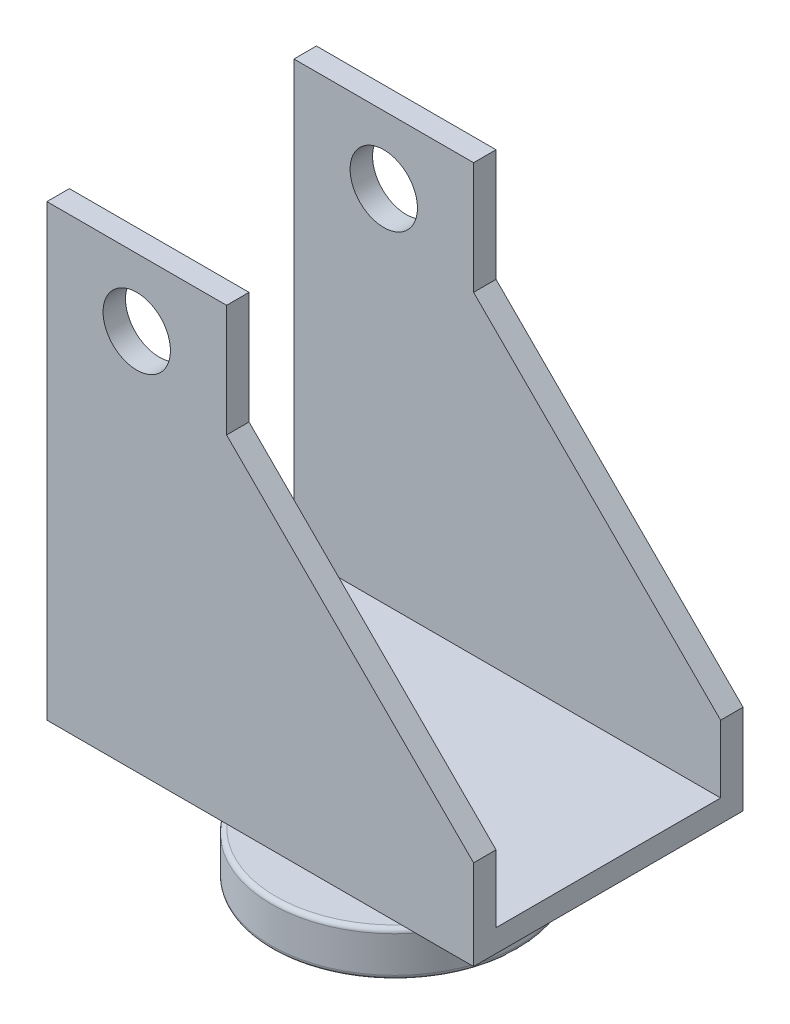
ISO-10303-21;
HEADER;
FILE_DESCRIPTION(('STEP AP214'),'2;1');
FILE_NAME('part.step','',(''),(''),'','','');
FILE_SCHEMA(('AUTOMOTIVE_DESIGN { 1 0 10303 214 1 1 1 1 }'));
ENDSEC;
DATA;
#1=APPLICATION_CONTEXT('core data for automotive mechanical design processes');
#2=APPLICATION_PROTOCOL_DEFINITION('international standard','automotive_design',2000,#1);
#3=PRODUCT_CONTEXT('',#1,'mechanical');
#4=PRODUCT('Part','Part','',(#3));
#5=PRODUCT_RELATED_PRODUCT_CATEGORY('part','',(#4));
#6=PRODUCT_DEFINITION_FORMATION('','',#4);
#7=PRODUCT_DEFINITION_CONTEXT('part definition',#1,'design');
#8=PRODUCT_DEFINITION('design','',#6,#7);
#9=PRODUCT_DEFINITION_SHAPE('','',#8);
#10=(LENGTH_UNIT() NAMED_UNIT(*) SI_UNIT(.MILLI.,.METRE.));
#11=(NAMED_UNIT(*) PLANE_ANGLE_UNIT() SI_UNIT($,.RADIAN.));
#12=(NAMED_UNIT(*) SI_UNIT($,.STERADIAN.) SOLID_ANGLE_UNIT());
#13=UNCERTAINTY_MEASURE_WITH_UNIT(LENGTH_MEASURE(1.E-05),#10,'distance_accuracy_value','');
#14=(GEOMETRIC_REPRESENTATION_CONTEXT(3) GLOBAL_UNCERTAINTY_ASSIGNED_CONTEXT((#13)) GLOBAL_UNIT_ASSIGNED_CONTEXT((#10,
#11,#12)) REPRESENTATION_CONTEXT('',''));
#15=CARTESIAN_POINT('',(0.,0.,0.));
#16=DIRECTION('',(0.,0.,1.));
#17=DIRECTION('',(1.,0.,0.));
#18=AXIS2_PLACEMENT_3D('',#15,#16,#17);
#19=CARTESIAN_POINT('',(95.,5.,-25.));
#20=DIRECTION('',(1.,0.,0.));
#21=DIRECTION('',(0.,0.,-1.));
#22=AXIS2_PLACEMENT_3D('',#19,#20,#21);
#23=PLANE('',#22);
#24=DIRECTION('',(0.,0.,1.));
#25=VECTOR('',#24,1.);
#26=CARTESIAN_POINT('',(95.,0.,-25.));
#27=LINE('',#26,#25);
#28=CARTESIAN_POINT('',(95.,0.,-30.));
#29=VERTEX_POINT('',#28);
#30=CARTESIAN_POINT('',(95.,0.,30.));
#31=VERTEX_POINT('',#30);
#32=EDGE_CURVE('E152',#29,#31,#27,.T.);
#33=ORIENTED_EDGE('',*,*,#32,.F.);
#34=DIRECTION('',(0.,-1.,0.));
#35=VECTOR('',#34,1.);
#36=CARTESIAN_POINT('',(95.,20.,-30.));
#37=LINE('',#36,#35);
#38=CARTESIAN_POINT('',(95.,20.,-30.));
#39=VERTEX_POINT('',#38);
#40=EDGE_CURVE('E135',#39,#29,#37,.T.);
#41=ORIENTED_EDGE('',*,*,#40,.F.);
#42=DIRECTION('',(0.,0.,1.));
#43=VECTOR('',#42,1.);
#44=CARTESIAN_POINT('',(95.,20.,-30.));
#45=LINE('',#44,#43);
#46=CARTESIAN_POINT('',(95.,20.,-25.));
#47=VERTEX_POINT('',#46);
#48=EDGE_CURVE('E143',#39,#47,#45,.T.);
#49=ORIENTED_EDGE('',*,*,#48,.T.);
#50=DIRECTION('',(0.,-1.,0.));
#51=VECTOR('',#50,1.);
#52=CARTESIAN_POINT('',(95.,20.,-25.));
#53=LINE('',#52,#51);
#54=CARTESIAN_POINT('',(95.,5.,-25.));
#55=VERTEX_POINT('',#54);
#56=EDGE_CURVE('E168',#47,#55,#53,.T.);
#57=ORIENTED_EDGE('',*,*,#56,.T.);
#58=DIRECTION('',(0.,0.,1.));
#59=VECTOR('',#58,1.);
#60=CARTESIAN_POINT('',(95.,5.,-25.));
#61=LINE('',#60,#59);
#62=CARTESIAN_POINT('',(95.,5.,25.));
#63=VERTEX_POINT('',#62);
#64=EDGE_CURVE('E55',#55,#63,#61,.T.);
#65=ORIENTED_EDGE('',*,*,#64,.T.);
#66=DIRECTION('',(0.,-1.,0.));
#67=VECTOR('',#66,1.);
#68=CARTESIAN_POINT('',(95.,20.,25.));
#69=LINE('',#68,#67);
#70=CARTESIAN_POINT('',(95.,20.,25.));
#71=VERTEX_POINT('',#70);
#72=EDGE_CURVE('E205',#71,#63,#69,.T.);
#73=ORIENTED_EDGE('',*,*,#72,.F.);
#74=DIRECTION('',(0.,0.,-1.));
#75=VECTOR('',#74,1.);
#76=CARTESIAN_POINT('',(95.,20.,30.));
#77=LINE('',#76,#75);
#78=CARTESIAN_POINT('',(95.,20.,30.));
#79=VERTEX_POINT('',#78);
#80=EDGE_CURVE('E218',#79,#71,#77,.T.);
#81=ORIENTED_EDGE('',*,*,#80,.F.);
#82=DIRECTION('',(0.,-1.,0.));
#83=VECTOR('',#82,1.);
#84=CARTESIAN_POINT('',(95.,20.,30.));
#85=LINE('',#84,#83);
#86=EDGE_CURVE('E186',#79,#31,#85,.T.);
#87=ORIENTED_EDGE('',*,*,#86,.T.);
#88=EDGE_LOOP('',(#33,#41,#49,#57,#65,#73,#81,#87));
#89=FACE_BOUND('',#88,.T.);
#90=ADVANCED_FACE('F40',(#89),#23,.T.);
#91=CARTESIAN_POINT('',(0.,5.,0.));
#92=DIRECTION('',(-1.,0.,0.));
#93=DIRECTION('',(0.,0.,1.));
#94=AXIS2_PLACEMENT_3D('',#91,#92,#93);
#95=PLANE('',#94);
#96=DIRECTION('',(0.,0.,-1.));
#97=VECTOR('',#96,1.);
#98=CARTESIAN_POINT('',(0.,0.,0.));
#99=LINE('',#98,#97);
#100=CARTESIAN_POINT('',(0.,0.,30.));
#101=VERTEX_POINT('',#100);
#102=CARTESIAN_POINT('',(0.,0.,-30.));
#103=VERTEX_POINT('',#102);
#104=EDGE_CURVE('E220',#101,#103,#99,.T.);
#105=ORIENTED_EDGE('',*,*,#104,.F.);
#106=DIRECTION('',(0.,1.,0.));
#107=VECTOR('',#106,1.);
#108=CARTESIAN_POINT('',(0.,0.,30.));
#109=LINE('',#108,#107);
#110=CARTESIAN_POINT('',(0.,100.,30.));
#111=VERTEX_POINT('',#110);
#112=EDGE_CURVE('E192',#101,#111,#109,.T.);
#113=ORIENTED_EDGE('',*,*,#112,.T.);
#114=DIRECTION('',(0.,0.,-1.));
#115=VECTOR('',#114,1.);
#116=CARTESIAN_POINT('',(0.,100.,30.));
#117=LINE('',#116,#115);
#118=CARTESIAN_POINT('',(0.,100.,25.));
#119=VERTEX_POINT('',#118);
#120=EDGE_CURVE('E204',#111,#119,#117,.T.);
#121=ORIENTED_EDGE('',*,*,#120,.T.);
#122=DIRECTION('',(0.,1.,0.));
#123=VECTOR('',#122,1.);
#124=CARTESIAN_POINT('',(0.,0.,25.));
#125=LINE('',#124,#123);
#126=CARTESIAN_POINT('',(0.,5.,25.));
#127=VERTEX_POINT('',#126);
#128=EDGE_CURVE('E208',#127,#119,#125,.T.);
#129=ORIENTED_EDGE('',*,*,#128,.F.);
#130=DIRECTION('',(0.,0.,-1.));
#131=VECTOR('',#130,1.);
#132=CARTESIAN_POINT('',(0.,5.,25.));
#133=LINE('',#132,#131);
#134=CARTESIAN_POINT('',(0.,5.,-25.));
#135=VERTEX_POINT('',#134);
#136=EDGE_CURVE('E63',#127,#135,#133,.T.);
#137=ORIENTED_EDGE('',*,*,#136,.T.);
#138=DIRECTION('',(0.,1.,0.));
#139=VECTOR('',#138,1.);
#140=CARTESIAN_POINT('',(0.,0.,-25.));
#141=LINE('',#140,#139);
#142=CARTESIAN_POINT('',(0.,100.,-25.));
#143=VERTEX_POINT('',#142);
#144=EDGE_CURVE('E154',#135,#143,#141,.T.);
#145=ORIENTED_EDGE('',*,*,#144,.T.);
#146=DIRECTION('',(0.,0.,1.));
#147=VECTOR('',#146,1.);
#148=CARTESIAN_POINT('',(0.,100.,-30.));
#149=LINE('',#148,#147);
#150=CARTESIAN_POINT('',(0.,100.,-30.));
#151=VERTEX_POINT('',#150);
#152=EDGE_CURVE('E175',#151,#143,#149,.T.);
#153=ORIENTED_EDGE('',*,*,#152,.F.);
#154=DIRECTION('',(0.,1.,0.));
#155=VECTOR('',#154,1.);
#156=CARTESIAN_POINT('',(0.,0.,-30.));
#157=LINE('',#156,#155);
#158=EDGE_CURVE('E165',#103,#151,#157,.T.);
#159=ORIENTED_EDGE('',*,*,#158,.F.);
#160=EDGE_LOOP('',(#105,#113,#121,#129,#137,#145,#153,#159));
#161=FACE_BOUND('',#160,.T.);
#162=ADVANCED_FACE('F271',(#161),#95,.T.);
#163=CARTESIAN_POINT('',(0.,5.,0.));
#164=DIRECTION('',(0.,-1.,0.));
#165=DIRECTION('',(0.,0.,-1.));
#166=AXIS2_PLACEMENT_3D('',#163,#164,#165);
#167=PLANE('',#166);
#168=ORIENTED_EDGE('',*,*,#136,.F.);
#169=DIRECTION('',(-1.,0.,0.));
#170=VECTOR('',#169,1.);
#171=CARTESIAN_POINT('',(95.,5.,25.));
#172=LINE('',#171,#170);
#173=EDGE_CURVE('E232',#63,#127,#172,.T.);
#174=ORIENTED_EDGE('',*,*,#173,.F.);
#175=ORIENTED_EDGE('',*,*,#64,.F.);
#176=DIRECTION('',(1.,0.,0.));
#177=VECTOR('',#176,1.);
#178=CARTESIAN_POINT('',(0.,5.,-25.));
#179=LINE('',#178,#177);
#180=EDGE_CURVE('E228',#135,#55,#179,.T.);
#181=ORIENTED_EDGE('',*,*,#180,.F.);
#182=EDGE_LOOP('',(#168,#174,#175,#181));
#183=FACE_BOUND('',#182,.T.);
#184=ADVANCED_FACE('F276',(#183),#167,.F.);
#185=CARTESIAN_POINT('',(0.,0.,0.));
#186=DIRECTION('',(0.,-1.,0.));
#187=DIRECTION('',(0.,0.,-1.));
#188=AXIS2_PLACEMENT_3D('',#185,#186,#187);
#189=PLANE('',#188);
#190=CARTESIAN_POINT('',(47.5,0.,0.));
#191=DIRECTION('',(0.,-1.,0.));
#192=DIRECTION('',(0.,0.,-1.));
#193=AXIS2_PLACEMENT_3D('',#190,#191,#192);
#194=CIRCLE('',#193,15.);
#195=CARTESIAN_POINT('',(47.5,0.,-15.));
#196=VERTEX_POINT('',#195);
#197=EDGE_CURVE('E235',#196,#196,#194,.T.);
#198=ORIENTED_EDGE('',*,*,#197,.F.);
#199=EDGE_LOOP('',(#198));
#200=FACE_BOUND('',#199,.T.);
#201=ORIENTED_EDGE('',*,*,#32,.T.);
#202=DIRECTION('',(-1.,0.,0.));
#203=VECTOR('',#202,1.);
#204=CARTESIAN_POINT('',(95.,0.,30.));
#205=LINE('',#204,#203);
#206=EDGE_CURVE('E188',#31,#101,#205,.T.);
#207=ORIENTED_EDGE('',*,*,#206,.T.);
#208=ORIENTED_EDGE('',*,*,#104,.T.);
#209=DIRECTION('',(-1.,0.,0.));
#210=VECTOR('',#209,1.);
#211=CARTESIAN_POINT('',(95.,0.,-30.));
#212=LINE('',#211,#210);
#213=EDGE_CURVE('E149',#29,#103,#212,.T.);
#214=ORIENTED_EDGE('',*,*,#213,.F.);
#215=EDGE_LOOP('',(#201,#207,#208,#214));
#216=FACE_BOUND('',#215,.T.);
#217=ADVANCED_FACE('F279',(#200,#216),#189,.T.);
#218=CARTESIAN_POINT('',(40.,75.,30.));
#219=DIRECTION('',(0.707106781186548,0.707106781186548,0.));
#220=DIRECTION('',(-0.707106781186548,0.707106781186548,0.));
#221=AXIS2_PLACEMENT_3D('',#218,#219,#220);
#222=PLANE('',#221);
#223=DIRECTION('',(0.707106781186548,-0.707106781186548,0.));
#224=VECTOR('',#223,1.);
#225=CARTESIAN_POINT('',(40.,75.,25.));
#226=LINE('',#225,#224);
#227=CARTESIAN_POINT('',(40.,75.,25.));
#228=VERTEX_POINT('',#227);
#229=EDGE_CURVE('E189',#228,#71,#226,.T.);
#230=ORIENTED_EDGE('',*,*,#229,.F.);
#231=DIRECTION('',(0.,0.,-1.));
#232=VECTOR('',#231,1.);
#233=CARTESIAN_POINT('',(40.,75.,30.));
#234=LINE('',#233,#232);
#235=CARTESIAN_POINT('',(40.,75.,30.));
#236=VERTEX_POINT('',#235);
#237=EDGE_CURVE('E221',#236,#228,#234,.T.);
#238=ORIENTED_EDGE('',*,*,#237,.F.);
#239=DIRECTION('',(0.707106781186548,-0.707106781186548,0.));
#240=VECTOR('',#239,1.);
#241=CARTESIAN_POINT('',(40.,75.,30.));
#242=LINE('',#241,#240);
#243=EDGE_CURVE('E201',#236,#79,#242,.T.);
#244=ORIENTED_EDGE('',*,*,#243,.T.);
#245=ORIENTED_EDGE('',*,*,#80,.T.);
#246=EDGE_LOOP('',(#230,#238,#244,#245));
#247=FACE_BOUND('',#246,.T.);
#248=ADVANCED_FACE('F282',(#247),#222,.T.);
#249=CARTESIAN_POINT('',(40.,100.,30.));
#250=DIRECTION('',(1.,0.,0.));
#251=DIRECTION('',(0.,0.,-1.));
#252=AXIS2_PLACEMENT_3D('',#249,#250,#251);
#253=PLANE('',#252);
#254=DIRECTION('',(0.,-1.,0.));
#255=VECTOR('',#254,1.);
#256=CARTESIAN_POINT('',(40.,100.,25.));
#257=LINE('',#256,#255);
#258=CARTESIAN_POINT('',(40.,100.,25.));
#259=VERTEX_POINT('',#258);
#260=EDGE_CURVE('E213',#259,#228,#257,.T.);
#261=ORIENTED_EDGE('',*,*,#260,.F.);
#262=DIRECTION('',(0.,0.,-1.));
#263=VECTOR('',#262,1.);
#264=CARTESIAN_POINT('',(40.,100.,30.));
#265=LINE('',#264,#263);
#266=CARTESIAN_POINT('',(40.,100.,30.));
#267=VERTEX_POINT('',#266);
#268=EDGE_CURVE('E223',#267,#259,#265,.T.);
#269=ORIENTED_EDGE('',*,*,#268,.F.);
#270=DIRECTION('',(0.,-1.,0.));
#271=VECTOR('',#270,1.);
#272=CARTESIAN_POINT('',(40.,100.,30.));
#273=LINE('',#272,#271);
#274=EDGE_CURVE('E198',#267,#236,#273,.T.);
#275=ORIENTED_EDGE('',*,*,#274,.T.);
#276=ORIENTED_EDGE('',*,*,#237,.T.);
#277=EDGE_LOOP('',(#261,#269,#275,#276));
#278=FACE_BOUND('',#277,.T.);
#279=ADVANCED_FACE('F291',(#278),#253,.T.);
#280=CARTESIAN_POINT('',(0.,100.,30.));
#281=DIRECTION('',(0.,1.,0.));
#282=DIRECTION('',(0.,0.,1.));
#283=AXIS2_PLACEMENT_3D('',#280,#281,#282);
#284=PLANE('',#283);
#285=DIRECTION('',(1.,0.,0.));
#286=VECTOR('',#285,1.);
#287=CARTESIAN_POINT('',(0.,100.,25.));
#288=LINE('',#287,#286);
#289=EDGE_CURVE('E210',#119,#259,#288,.T.);
#290=ORIENTED_EDGE('',*,*,#289,.F.);
#291=ORIENTED_EDGE('',*,*,#120,.F.);
#292=DIRECTION('',(1.,0.,0.));
#293=VECTOR('',#292,1.);
#294=CARTESIAN_POINT('',(0.,100.,30.));
#295=LINE('',#294,#293);
#296=EDGE_CURVE('E195',#111,#267,#295,.T.);
#297=ORIENTED_EDGE('',*,*,#296,.T.);
#298=ORIENTED_EDGE('',*,*,#268,.T.);
#299=EDGE_LOOP('',(#290,#291,#297,#298));
#300=FACE_BOUND('',#299,.T.);
#301=ADVANCED_FACE('F287',(#300),#284,.T.);
#302=CARTESIAN_POINT('',(0.,0.,30.));
#303=DIRECTION('',(0.,0.,-1.));
#304=DIRECTION('',(-1.,0.,0.));
#305=AXIS2_PLACEMENT_3D('',#302,#303,#304);
#306=PLANE('',#305);
#307=CARTESIAN_POINT('',(20.,85.,30.));
#308=DIRECTION('',(0.,0.,1.));
#309=DIRECTION('',(1.,0.,0.));
#310=AXIS2_PLACEMENT_3D('',#307,#308,#309);
#311=CIRCLE('',#310,7.5);
#312=CARTESIAN_POINT('',(27.5,85.,30.));
#313=VERTEX_POINT('',#312);
#314=EDGE_CURVE('E178',#313,#313,#311,.T.);
#315=ORIENTED_EDGE('',*,*,#314,.F.);
#316=EDGE_LOOP('',(#315));
#317=FACE_BOUND('',#316,.T.);
#318=ORIENTED_EDGE('',*,*,#86,.F.);
#319=ORIENTED_EDGE('',*,*,#243,.F.);
#320=ORIENTED_EDGE('',*,*,#274,.F.);
#321=ORIENTED_EDGE('',*,*,#296,.F.);
#322=ORIENTED_EDGE('',*,*,#112,.F.);
#323=ORIENTED_EDGE('',*,*,#206,.F.);
#324=EDGE_LOOP('',(#318,#319,#320,#321,#322,#323));
#325=FACE_BOUND('',#324,.T.);
#326=ADVANCED_FACE('F290',(#317,#325),#306,.F.);
#327=CARTESIAN_POINT('',(0.,0.,25.));
#328=DIRECTION('',(0.,0.,-1.));
#329=DIRECTION('',(-1.,0.,0.));
#330=AXIS2_PLACEMENT_3D('',#327,#328,#329);
#331=PLANE('',#330);
#332=CARTESIAN_POINT('',(20.,85.,25.));
#333=DIRECTION('',(0.,0.,-1.));
#334=DIRECTION('',(-1.,0.,0.));
#335=AXIS2_PLACEMENT_3D('',#332,#333,#334);
#336=CIRCLE('',#335,7.5);
#337=CARTESIAN_POINT('',(12.5,85.,25.));
#338=VERTEX_POINT('',#337);
#339=EDGE_CURVE('E185',#338,#338,#336,.T.);
#340=ORIENTED_EDGE('',*,*,#339,.F.);
#341=EDGE_LOOP('',(#340));
#342=FACE_BOUND('',#341,.T.);
#343=ORIENTED_EDGE('',*,*,#72,.T.);
#344=ORIENTED_EDGE('',*,*,#173,.T.);
#345=ORIENTED_EDGE('',*,*,#128,.T.);
#346=ORIENTED_EDGE('',*,*,#289,.T.);
#347=ORIENTED_EDGE('',*,*,#260,.T.);
#348=ORIENTED_EDGE('',*,*,#229,.T.);
#349=EDGE_LOOP('',(#343,#344,#345,#346,#347,#348));
#350=FACE_BOUND('',#349,.T.);
#351=ADVANCED_FACE('F299',(#342,#350),#331,.T.);
#352=CARTESIAN_POINT('',(20.,85.,-25.));
#353=DIRECTION('',(0.,0.,1.));
#354=DIRECTION('',(1.,0.,0.));
#355=AXIS2_PLACEMENT_3D('',#352,#353,#354);
#356=CYLINDRICAL_SURFACE('',#355,7.5);
#357=ORIENTED_EDGE('',*,*,#339,.T.);
#358=EDGE_LOOP('',(#357));
#359=FACE_BOUND('',#358,.T.);
#360=ORIENTED_EDGE('',*,*,#314,.T.);
#361=EDGE_LOOP('',(#360));
#362=FACE_BOUND('',#361,.T.);
#363=ADVANCED_FACE('F302',(#359,#362),#356,.F.);
#364=CARTESIAN_POINT('',(0.,100.,-30.));
#365=DIRECTION('',(0.,-1.,0.));
#366=DIRECTION('',(0.,0.,-1.));
#367=AXIS2_PLACEMENT_3D('',#364,#365,#366);
#368=PLANE('',#367);
#369=DIRECTION('',(1.,0.,0.));
#370=VECTOR('',#369,1.);
#371=CARTESIAN_POINT('',(0.,100.,-25.));
#372=LINE('',#371,#370);
#373=CARTESIAN_POINT('',(40.,100.,-25.));
#374=VERTEX_POINT('',#373);
#375=EDGE_CURVE('E156',#143,#374,#372,.T.);
#376=ORIENTED_EDGE('',*,*,#375,.T.);
#377=DIRECTION('',(0.,0.,1.));
#378=VECTOR('',#377,1.);
#379=CARTESIAN_POINT('',(40.,100.,-30.));
#380=LINE('',#379,#378);
#381=CARTESIAN_POINT('',(40.,100.,-30.));
#382=VERTEX_POINT('',#381);
#383=EDGE_CURVE('E179',#382,#374,#380,.T.);
#384=ORIENTED_EDGE('',*,*,#383,.F.);
#385=DIRECTION('',(1.,0.,0.));
#386=VECTOR('',#385,1.);
#387=CARTESIAN_POINT('',(0.,100.,-30.));
#388=LINE('',#387,#386);
#389=EDGE_CURVE('E163',#151,#382,#388,.T.);
#390=ORIENTED_EDGE('',*,*,#389,.F.);
#391=ORIENTED_EDGE('',*,*,#152,.T.);
#392=EDGE_LOOP('',(#376,#384,#390,#391));
#393=FACE_BOUND('',#392,.T.);
#394=ADVANCED_FACE('F309',(#393),#368,.F.);
#395=CARTESIAN_POINT('',(40.,100.,-30.));
#396=DIRECTION('',(-1.,0.,0.));
#397=DIRECTION('',(0.,0.,1.));
#398=AXIS2_PLACEMENT_3D('',#395,#396,#397);
#399=PLANE('',#398);
#400=DIRECTION('',(0.,-1.,0.));
#401=VECTOR('',#400,1.);
#402=CARTESIAN_POINT('',(40.,100.,-25.));
#403=LINE('',#402,#401);
#404=CARTESIAN_POINT('',(40.,75.,-25.));
#405=VERTEX_POINT('',#404);
#406=EDGE_CURVE('E172',#374,#405,#403,.T.);
#407=ORIENTED_EDGE('',*,*,#406,.T.);
#408=DIRECTION('',(0.,0.,1.));
#409=VECTOR('',#408,1.);
#410=CARTESIAN_POINT('',(40.,75.,-30.));
#411=LINE('',#410,#409);
#412=CARTESIAN_POINT('',(40.,75.,-30.));
#413=VERTEX_POINT('',#412);
#414=EDGE_CURVE('E148',#413,#405,#411,.T.);
#415=ORIENTED_EDGE('',*,*,#414,.F.);
#416=DIRECTION('',(0.,-1.,0.));
#417=VECTOR('',#416,1.);
#418=CARTESIAN_POINT('',(40.,100.,-30.));
#419=LINE('',#418,#417);
#420=EDGE_CURVE('E137',#382,#413,#419,.T.);
#421=ORIENTED_EDGE('',*,*,#420,.F.);
#422=ORIENTED_EDGE('',*,*,#383,.T.);
#423=EDGE_LOOP('',(#407,#415,#421,#422));
#424=FACE_BOUND('',#423,.T.);
#425=ADVANCED_FACE('F313',(#424),#399,.F.);
#426=CARTESIAN_POINT('',(40.,75.,-30.));
#427=DIRECTION('',(-0.707106781186548,-0.707106781186548,0.));
#428=DIRECTION('',(0.707106781186548,-0.707106781186548,0.));
#429=AXIS2_PLACEMENT_3D('',#426,#427,#428);
#430=PLANE('',#429);
#431=DIRECTION('',(0.707106781186548,-0.707106781186548,0.));
#432=VECTOR('',#431,1.);
#433=CARTESIAN_POINT('',(40.,75.,-25.));
#434=LINE('',#433,#432);
#435=EDGE_CURVE('E146',#405,#47,#434,.T.);
#436=ORIENTED_EDGE('',*,*,#435,.T.);
#437=ORIENTED_EDGE('',*,*,#48,.F.);
#438=DIRECTION('',(0.707106781186548,-0.707106781186548,0.));
#439=VECTOR('',#438,1.);
#440=CARTESIAN_POINT('',(40.,75.,-30.));
#441=LINE('',#440,#439);
#442=EDGE_CURVE('E130',#413,#39,#441,.T.);
#443=ORIENTED_EDGE('',*,*,#442,.F.);
#444=ORIENTED_EDGE('',*,*,#414,.T.);
#445=EDGE_LOOP('',(#436,#437,#443,#444));
#446=FACE_BOUND('',#445,.T.);
#447=ADVANCED_FACE('F144',(#446),#430,.F.);
#448=CARTESIAN_POINT('',(0.,0.,-30.));
#449=DIRECTION('',(0.,0.,1.));
#450=DIRECTION('',(-1.,0.,0.));
#451=AXIS2_PLACEMENT_3D('',#448,#449,#450);
#452=PLANE('',#451);
#453=CARTESIAN_POINT('',(20.,85.,-30.));
#454=DIRECTION('',(0.,0.,1.));
#455=DIRECTION('',(1.,0.,0.));
#456=AXIS2_PLACEMENT_3D('',#453,#454,#455);
#457=CIRCLE('',#456,7.5);
#458=CARTESIAN_POINT('',(27.5,85.,-30.));
#459=VERTEX_POINT('',#458);
#460=EDGE_CURVE('E159',#459,#459,#457,.T.);
#461=ORIENTED_EDGE('',*,*,#460,.T.);
#462=EDGE_LOOP('',(#461));
#463=FACE_BOUND('',#462,.T.);
#464=ORIENTED_EDGE('',*,*,#40,.T.);
#465=ORIENTED_EDGE('',*,*,#213,.T.);
#466=ORIENTED_EDGE('',*,*,#158,.T.);
#467=ORIENTED_EDGE('',*,*,#389,.T.);
#468=ORIENTED_EDGE('',*,*,#420,.T.);
#469=ORIENTED_EDGE('',*,*,#442,.T.);
#470=EDGE_LOOP('',(#464,#465,#466,#467,#468,#469));
#471=FACE_BOUND('',#470,.T.);
#472=ADVANCED_FACE('F132',(#463,#471),#452,.F.);
#473=CARTESIAN_POINT('',(0.,0.,-25.));
#474=DIRECTION('',(0.,0.,1.));
#475=DIRECTION('',(-1.,0.,0.));
#476=AXIS2_PLACEMENT_3D('',#473,#474,#475);
#477=PLANE('',#476);
#478=CARTESIAN_POINT('',(20.,85.,-25.));
#479=DIRECTION('',(0.,0.,1.));
#480=DIRECTION('',(1.,0.,0.));
#481=AXIS2_PLACEMENT_3D('',#478,#479,#480);
#482=CIRCLE('',#481,7.5);
#483=CARTESIAN_POINT('',(27.5,85.,-25.));
#484=VERTEX_POINT('',#483);
#485=EDGE_CURVE('E170',#484,#484,#482,.F.);
#486=ORIENTED_EDGE('',*,*,#485,.T.);
#487=EDGE_LOOP('',(#486));
#488=FACE_BOUND('',#487,.T.);
#489=ORIENTED_EDGE('',*,*,#144,.F.);
#490=ORIENTED_EDGE('',*,*,#180,.T.);
#491=ORIENTED_EDGE('',*,*,#56,.F.);
#492=ORIENTED_EDGE('',*,*,#435,.F.);
#493=ORIENTED_EDGE('',*,*,#406,.F.);
#494=ORIENTED_EDGE('',*,*,#375,.F.);
#495=EDGE_LOOP('',(#489,#490,#491,#492,#493,#494));
#496=FACE_BOUND('',#495,.T.);
#497=ADVANCED_FACE('F320',(#488,#496),#477,.T.);
#498=CARTESIAN_POINT('',(20.,85.,30.));
#499=DIRECTION('',(0.,0.,-1.));
#500=DIRECTION('',(-1.,0.,0.));
#501=AXIS2_PLACEMENT_3D('',#498,#499,#500);
#502=CYLINDRICAL_SURFACE('',#501,7.5);
#503=ORIENTED_EDGE('',*,*,#485,.F.);
#504=EDGE_LOOP('',(#503));
#505=FACE_BOUND('',#504,.T.);
#506=ORIENTED_EDGE('',*,*,#460,.F.);
#507=EDGE_LOOP('',(#506));
#508=FACE_BOUND('',#507,.T.);
#509=ADVANCED_FACE('F323',(#505,#508),#502,.F.);
#510=CARTESIAN_POINT('',(47.5,-12.,0.));
#511=DIRECTION('',(0.,1.,0.));
#512=DIRECTION('',(0.,0.,1.));
#513=AXIS2_PLACEMENT_3D('',#510,#511,#512);
#514=CYLINDRICAL_SURFACE('',#513,15.);
#515=CARTESIAN_POINT('',(47.5,-12.,0.));
#516=DIRECTION('',(0.,-1.,0.));
#517=DIRECTION('',(0.,0.,-1.));
#518=AXIS2_PLACEMENT_3D('',#515,#516,#517);
#519=CIRCLE('',#518,15.);
#520=CARTESIAN_POINT('',(47.5,-12.,-15.));
#521=VERTEX_POINT('',#520);
#522=EDGE_CURVE('E338',#521,#521,#519,.T.);
#523=ORIENTED_EDGE('',*,*,#522,.F.);
#524=EDGE_LOOP('',(#523));
#525=FACE_BOUND('',#524,.T.);
#526=ORIENTED_EDGE('',*,*,#197,.T.);
#527=EDGE_LOOP('',(#526));
#528=FACE_BOUND('',#527,.T.);
#529=ADVANCED_FACE('F268',(#525,#528),#514,.T.);
#530=CARTESIAN_POINT('',(47.5,-22.,0.));
#531=DIRECTION('',(0.,1.,0.));
#532=DIRECTION('',(0.,0.,1.));
#533=AXIS2_PLACEMENT_3D('',#530,#531,#532);
#534=CYLINDRICAL_SURFACE('',#533,27.5);
#535=CARTESIAN_POINT('',(47.5,-21.,0.));
#536=DIRECTION('',(0.,-1.,0.));
#537=DIRECTION('',(0.,0.,-1.));
#538=AXIS2_PLACEMENT_3D('',#535,#536,#537);
#539=CIRCLE('',#538,27.5);
#540=CARTESIAN_POINT('',(47.5,-21.,-27.5));
#541=VERTEX_POINT('',#540);
#542=EDGE_CURVE('E48',#541,#541,#539,.F.);
#543=ORIENTED_EDGE('',*,*,#542,.T.);
#544=EDGE_LOOP('',(#543));
#545=FACE_BOUND('',#544,.T.);
#546=CARTESIAN_POINT('',(47.5,-13.,0.));
#547=DIRECTION('',(0.,-1.,0.));
#548=DIRECTION('',(0.,0.,-1.));
#549=AXIS2_PLACEMENT_3D('',#546,#547,#548);
#550=CIRCLE('',#549,27.5);
#551=CARTESIAN_POINT('',(47.5,-13.,-27.5));
#552=VERTEX_POINT('',#551);
#553=EDGE_CURVE('E245',#552,#552,#550,.T.);
#554=ORIENTED_EDGE('',*,*,#553,.T.);
#555=EDGE_LOOP('',(#554));
#556=FACE_BOUND('',#555,.T.);
#557=ADVANCED_FACE('F250',(#545,#556),#534,.T.);
#558=CARTESIAN_POINT('',(47.5,-22.,0.));
#559=DIRECTION('',(0.,-1.,0.));
#560=DIRECTION('',(0.,0.,-1.));
#561=AXIS2_PLACEMENT_3D('',#558,#559,#560);
#562=PLANE('',#561);
#563=CARTESIAN_POINT('',(47.5,-22.,0.));
#564=DIRECTION('',(0.,-1.,0.));
#565=DIRECTION('',(0.,0.,-1.));
#566=AXIS2_PLACEMENT_3D('',#563,#564,#565);
#567=CIRCLE('',#566,26.5);
#568=CARTESIAN_POINT('',(47.5,-22.,-26.5));
#569=VERTEX_POINT('',#568);
#570=EDGE_CURVE('E242',#569,#569,#567,.T.);
#571=ORIENTED_EDGE('',*,*,#570,.T.);
#572=EDGE_LOOP('',(#571));
#573=FACE_BOUND('',#572,.T.);
#574=ADVANCED_FACE('F259',(#573),#562,.T.);
#575=CARTESIAN_POINT('',(47.5,-12.,0.));
#576=DIRECTION('',(0.,-1.,0.));
#577=DIRECTION('',(0.,0.,-1.));
#578=AXIS2_PLACEMENT_3D('',#575,#576,#577);
#579=PLANE('',#578);
#580=CARTESIAN_POINT('',(47.5,-12.,0.));
#581=DIRECTION('',(0.,-1.,0.));
#582=DIRECTION('',(0.,0.,-1.));
#583=AXIS2_PLACEMENT_3D('',#580,#581,#582);
#584=CIRCLE('',#583,26.5);
#585=CARTESIAN_POINT('',(47.5,-12.,-26.5));
#586=VERTEX_POINT('',#585);
#587=EDGE_CURVE('E11',#586,#586,#584,.F.);
#588=ORIENTED_EDGE('',*,*,#587,.T.);
#589=EDGE_LOOP('',(#588));
#590=FACE_BOUND('',#589,.T.);
#591=ORIENTED_EDGE('',*,*,#522,.T.);
#592=EDGE_LOOP('',(#591));
#593=FACE_BOUND('',#592,.T.);
#594=ADVANCED_FACE('F256',(#590,#593),#579,.F.);
#595=CARTESIAN_POINT('',(47.5,-21.,0.));
#596=DIRECTION('',(0.,-1.,0.));
#597=DIRECTION('',(0.,0.,-1.));
#598=AXIS2_PLACEMENT_3D('',#595,#596,#597);
#599=TOROIDAL_SURFACE('',#598,26.5,1.);
#600=ORIENTED_EDGE('',*,*,#542,.F.);
#601=EDGE_LOOP('',(#600));
#602=FACE_BOUND('',#601,.T.);
#603=ORIENTED_EDGE('',*,*,#570,.F.);
#604=EDGE_LOOP('',(#603));
#605=FACE_BOUND('',#604,.T.);
#606=ADVANCED_FACE('F253',(#602,#605),#599,.T.);
#607=CARTESIAN_POINT('',(47.5,-13.,0.));
#608=DIRECTION('',(0.,-1.,0.));
#609=DIRECTION('',(0.,0.,-1.));
#610=AXIS2_PLACEMENT_3D('',#607,#608,#609);
#611=TOROIDAL_SURFACE('',#610,26.5,1.);
#612=ORIENTED_EDGE('',*,*,#587,.F.);
#613=EDGE_LOOP('',(#612));
#614=FACE_BOUND('',#613,.T.);
#615=ORIENTED_EDGE('',*,*,#553,.F.);
#616=EDGE_LOOP('',(#615));
#617=FACE_BOUND('',#616,.T.);
#618=ADVANCED_FACE('F42',(#614,#617),#611,.T.);
#619=CLOSED_SHELL('',(#90,#162,#184,#217,#248,#279,#301,#326,#351,#363,#394,#425,#447,#472,#497,
#509,#529,#557,#574,#594,#606,#618));
#620=MANIFOLD_SOLID_BREP('B2',#619);
#621=ADVANCED_BREP_SHAPE_REPRESENTATION('',(#18,#620),#14);
#622=SHAPE_DEFINITION_REPRESENTATION(#9,#621);
ENDSEC;
END-ISO-10303-21;
